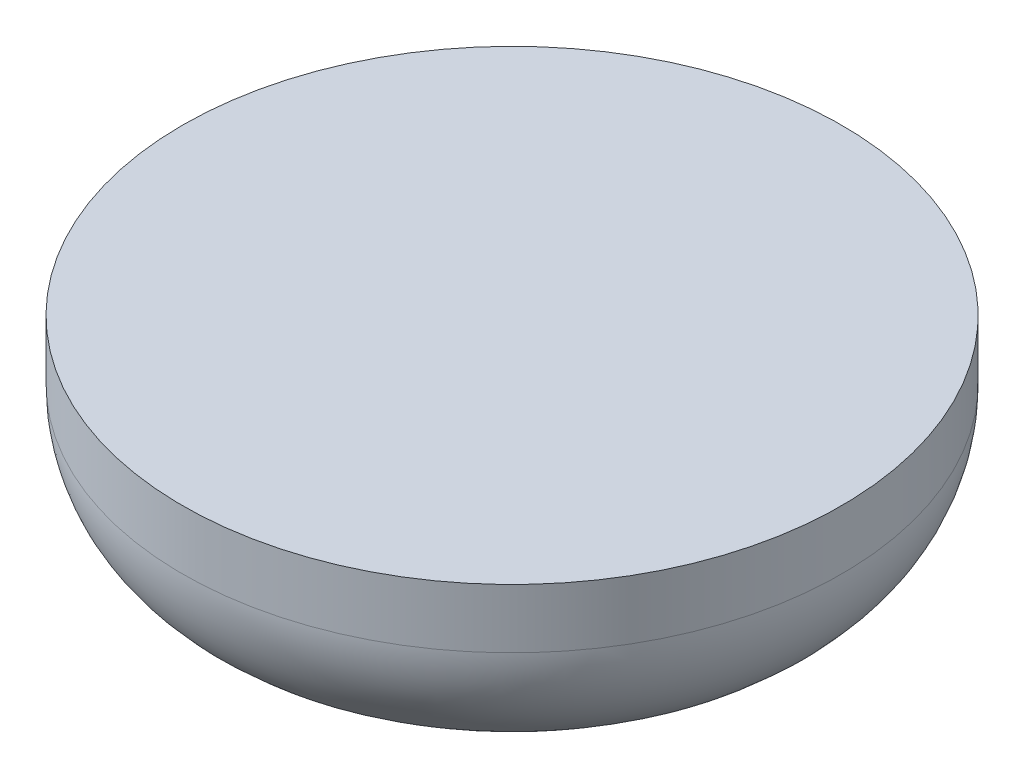
ISO-10303-21;
HEADER;
FILE_DESCRIPTION(('STEP AP214'),'2;1');
FILE_NAME('part.step','',(''),(''),'','','');
FILE_SCHEMA(('AUTOMOTIVE_DESIGN { 1 0 10303 214 1 1 1 1 }'));
ENDSEC;
DATA;
#1=APPLICATION_CONTEXT('core data for automotive mechanical design processes');
#2=APPLICATION_PROTOCOL_DEFINITION('international standard','automotive_design',2000,#1);
#3=PRODUCT_CONTEXT('',#1,'mechanical');
#4=PRODUCT('Part','Part','',(#3));
#5=PRODUCT_RELATED_PRODUCT_CATEGORY('part','',(#4));
#6=PRODUCT_DEFINITION_FORMATION('','',#4);
#7=PRODUCT_DEFINITION_CONTEXT('part definition',#1,'design');
#8=PRODUCT_DEFINITION('design','',#6,#7);
#9=PRODUCT_DEFINITION_SHAPE('','',#8);
#10=(LENGTH_UNIT() NAMED_UNIT(*) SI_UNIT(.MILLI.,.METRE.));
#11=(NAMED_UNIT(*) PLANE_ANGLE_UNIT() SI_UNIT($,.RADIAN.));
#12=(NAMED_UNIT(*) SI_UNIT($,.STERADIAN.) SOLID_ANGLE_UNIT());
#13=UNCERTAINTY_MEASURE_WITH_UNIT(LENGTH_MEASURE(1.E-05),#10,'distance_accuracy_value','');
#14=(GEOMETRIC_REPRESENTATION_CONTEXT(3) GLOBAL_UNCERTAINTY_ASSIGNED_CONTEXT((#13)) GLOBAL_UNIT_ASSIGNED_CONTEXT((#10,
#11,#12)) REPRESENTATION_CONTEXT('',''));
#15=CARTESIAN_POINT('',(0.,0.,0.));
#16=DIRECTION('',(0.,0.,1.));
#17=DIRECTION('',(1.,0.,0.));
#18=AXIS2_PLACEMENT_3D('',#15,#16,#17);
#19=CARTESIAN_POINT('',(-132.302873543367,-208.077272168841,-830.322188707988));
#20=DIRECTION('',(0.898794046299164,0.,-0.438371146789083));
#21=DIRECTION('',(-0.438371146789083,0.,-0.898794046299164));
#22=AXIS2_PLACEMENT_3D('',#19,#20,#21);
#23=PLANE('',#22);
#24=DIRECTION('',(0.,-1.,0.));
#25=VECTOR('',#24,1.);
#26=CARTESIAN_POINT('',(-132.305641032304,-208.077272165475,-830.327862901188));
#27=LINE('',#26,#25);
#28=CARTESIAN_POINT('',(-132.305641032303,-209.804472168841,-830.327862901185));
#29=VERTEX_POINT('',#28);
#30=CARTESIAN_POINT('',(-132.305641032348,-208.077272168841,-830.32786290128));
#31=VERTEX_POINT('',#30);
#32=EDGE_CURVE('E283',#29,#31,#27,.F.);
#33=ORIENTED_EDGE('',*,*,#32,.F.);
#34=DIRECTION('',(-0.438371146789083,0.,-0.898794046299164));
#35=VECTOR('',#34,1.);
#36=CARTESIAN_POINT('',(-132.302873543367,-209.804472168841,-830.322188707988));
#37=LINE('',#36,#35);
#38=CARTESIAN_POINT('',(-132.302873543382,-209.804472168841,-830.322188707977));
#39=VERTEX_POINT('',#38);
#40=EDGE_CURVE('E430',#39,#29,#37,.T.);
#41=ORIENTED_EDGE('',*,*,#40,.F.);
#42=DIRECTION('',(0.,-1.,0.));
#43=VECTOR('',#42,1.);
#44=CARTESIAN_POINT('',(-132.302873543396,-208.077272168841,-830.322188707964));
#45=LINE('',#44,#43);
#46=CARTESIAN_POINT('',(-132.302873543382,-208.077272168841,-830.322188707976));
#47=VERTEX_POINT('',#46);
#48=EDGE_CURVE('E278',#39,#47,#45,.F.);
#49=ORIENTED_EDGE('',*,*,#48,.T.);
#50=DIRECTION('',(0.438371146603138,0.,0.898794046389856));
#51=VECTOR('',#50,1.);
#52=CARTESIAN_POINT('',(-132.305641032299,-208.077272168841,-830.327862901179));
#53=LINE('',#52,#51);
#54=EDGE_CURVE('E300',#31,#47,#53,.T.);
#55=ORIENTED_EDGE('',*,*,#54,.F.);
#56=EDGE_LOOP('',(#33,#41,#49,#55));
#57=FACE_BOUND('',#56,.T.);
#58=ADVANCED_FACE('F17',(#57),#23,.F.);
#59=CARTESIAN_POINT('',(-133.340258604089,-209.804472168841,-829.723254163927));
#60=DIRECTION('',(-0.829037572555082,0.,0.559192903470687));
#61=DIRECTION('',(0.559192903470687,0.,0.829037572555082));
#62=AXIS2_PLACEMENT_3D('',#59,#60,#61);
#63=PLANE('',#62);
#64=DIRECTION('',(0.,-1.,0.));
#65=VECTOR('',#64,1.);
#66=CARTESIAN_POINT('',(-133.340258604088,-208.077272168841,-829.72325416393));
#67=LINE('',#66,#65);
#68=CARTESIAN_POINT('',(-133.340258604088,-208.077272168841,-829.72325416393));
#69=VERTEX_POINT('',#68);
#70=CARTESIAN_POINT('',(-133.340258604089,-209.804472168841,-829.723254163929));
#71=VERTEX_POINT('',#70);
#72=EDGE_CURVE('E282',#69,#71,#67,.T.);
#73=ORIENTED_EDGE('',*,*,#72,.T.);
#74=DIRECTION('',(0.559192903470687,0.,0.829037572555082));
#75=VECTOR('',#74,1.);
#76=CARTESIAN_POINT('',(-133.340258604089,-209.804472168841,-829.723254163927));
#77=LINE('',#76,#75);
#78=CARTESIAN_POINT('',(-133.343788855076,-209.804472168841,-829.728487976251));
#79=VERTEX_POINT('',#78);
#80=EDGE_CURVE('E429',#79,#71,#77,.T.);
#81=ORIENTED_EDGE('',*,*,#80,.F.);
#82=DIRECTION('',(0.,-1.,0.));
#83=VECTOR('',#82,1.);
#84=CARTESIAN_POINT('',(-133.343788855079,-208.077272168841,-829.728487976257));
#85=LINE('',#84,#83);
#86=CARTESIAN_POINT('',(-133.343788855171,-208.077272168841,-829.728487976392));
#87=VERTEX_POINT('',#86);
#88=EDGE_CURVE('E277',#87,#79,#85,.T.);
#89=ORIENTED_EDGE('',*,*,#88,.F.);
#90=DIRECTION('',(-0.559192903748581,0.,-0.82903757236764));
#91=VECTOR('',#90,1.);
#92=CARTESIAN_POINT('',(-133.340258604088,-208.077272168841,-829.72325416393));
#93=LINE('',#92,#91);
#94=EDGE_CURVE('E416',#69,#87,#93,.T.);
#95=ORIENTED_EDGE('',*,*,#94,.F.);
#96=EDGE_LOOP('',(#73,#81,#89,#95));
#97=FACE_BOUND('',#96,.T.);
#98=ADVANCED_FACE('F564',(#97),#63,.F.);
#99=CARTESIAN_POINT('',(-135.028393202501,-209.804472168841,-829.728487976248));
#100=DIRECTION('',(0.829037572555081,0.,0.559192903470688));
#101=DIRECTION('',(0.559192903470688,0.,-0.829037572555081));
#102=AXIS2_PLACEMENT_3D('',#99,#100,#101);
#103=PLANE('',#102);
#104=DIRECTION('',(0.,-1.,0.));
#105=VECTOR('',#104,1.);
#106=CARTESIAN_POINT('',(-135.028393202503,-208.077272168841,-829.728487976248));
#107=LINE('',#106,#105);
#108=CARTESIAN_POINT('',(-135.028393202503,-209.804472168841,-829.728487976247));
#109=VERTEX_POINT('',#108);
#110=CARTESIAN_POINT('',(-135.028393202572,-208.077272168841,-829.728487976146));
#111=VERTEX_POINT('',#110);
#112=EDGE_CURVE('E273',#109,#111,#107,.F.);
#113=ORIENTED_EDGE('',*,*,#112,.F.);
#114=DIRECTION('',(0.559192903470688,0.,-0.829037572555081));
#115=VECTOR('',#114,1.);
#116=CARTESIAN_POINT('',(-135.028393202501,-209.804472168841,-829.728487976248));
#117=LINE('',#116,#115);
#118=CARTESIAN_POINT('',(-135.031923453496,-209.804472168841,-829.723254163932));
#119=VERTEX_POINT('',#118);
#120=EDGE_CURVE('E427',#119,#109,#117,.T.);
#121=ORIENTED_EDGE('',*,*,#120,.F.);
#122=DIRECTION('',(0.,-1.,0.));
#123=VECTOR('',#122,1.);
#124=CARTESIAN_POINT('',(-135.031923453506,-208.077272168841,-829.723254163935));
#125=LINE('',#124,#123);
#126=CARTESIAN_POINT('',(-135.031923453496,-208.077272168841,-829.723254163932));
#127=VERTEX_POINT('',#126);
#128=EDGE_CURVE('E268',#119,#127,#125,.F.);
#129=ORIENTED_EDGE('',*,*,#128,.T.);
#130=DIRECTION('',(-0.559192903271263,0.,0.829037572689595));
#131=VECTOR('',#130,1.);
#132=CARTESIAN_POINT('',(-135.028393202519,-208.077272168841,-829.728487976225));
#133=LINE('',#132,#131);
#134=EDGE_CURVE('E413',#111,#127,#133,.T.);
#135=ORIENTED_EDGE('',*,*,#134,.F.);
#136=EDGE_LOOP('',(#113,#121,#129,#135));
#137=FACE_BOUND('',#136,.T.);
#138=ADVANCED_FACE('F561',(#137),#103,.F.);
#139=CARTESIAN_POINT('',(-136.06930851421,-208.077272168841,-830.322188707988));
#140=DIRECTION('',(-0.898794046299164,0.,-0.438371146789084));
#141=DIRECTION('',(-0.438371146789084,0.,0.898794046299164));
#142=AXIS2_PLACEMENT_3D('',#139,#140,#141);
#143=PLANE('',#142);
#144=DIRECTION('',(0.,-1.,0.));
#145=VECTOR('',#144,1.);
#146=CARTESIAN_POINT('',(-136.069308514209,-208.077272168841,-830.32218870799));
#147=LINE('',#146,#145);
#148=CARTESIAN_POINT('',(-136.069308514209,-208.077272168841,-830.32218870799));
#149=VERTEX_POINT('',#148);
#150=CARTESIAN_POINT('',(-136.069308514209,-209.804472168841,-830.32218870799));
#151=VERTEX_POINT('',#150);
#152=EDGE_CURVE('E272',#149,#151,#147,.T.);
#153=ORIENTED_EDGE('',*,*,#152,.T.);
#154=DIRECTION('',(-0.438371146789084,0.,0.898794046299164));
#155=VECTOR('',#154,1.);
#156=CARTESIAN_POINT('',(-136.06930851421,-209.804472168841,-830.322188707988));
#157=LINE('',#156,#155);
#158=CARTESIAN_POINT('',(-136.066541025279,-209.804472168841,-830.327862901175));
#159=VERTEX_POINT('',#158);
#160=EDGE_CURVE('E425',#159,#151,#157,.T.);
#161=ORIENTED_EDGE('',*,*,#160,.F.);
#162=DIRECTION('',(0.,-1.,0.));
#163=VECTOR('',#162,1.);
#164=CARTESIAN_POINT('',(-136.066541025283,-208.077272166654,-830.327862901168));
#165=LINE('',#164,#163);
#166=CARTESIAN_POINT('',(-136.066541025289,-208.077272168841,-830.327862901155));
#167=VERTEX_POINT('',#166);
#168=EDGE_CURVE('E264',#167,#159,#165,.T.);
#169=ORIENTED_EDGE('',*,*,#168,.F.);
#170=DIRECTION('',(0.438371146827899,0.,-0.898794046280232));
#171=VECTOR('',#170,1.);
#172=CARTESIAN_POINT('',(-136.069308514209,-208.077272168841,-830.32218870799));
#173=LINE('',#172,#171);
#174=EDGE_CURVE('E298',#149,#167,#173,.T.);
#175=ORIENTED_EDGE('',*,*,#174,.F.);
#176=EDGE_LOOP('',(#153,#161,#169,#175));
#177=FACE_BOUND('',#176,.T.);
#178=ADVANCED_FACE('F557',(#177),#143,.F.);
#179=CARTESIAN_POINT('',(-136.909252698702,-209.804472168841,-831.786801696392));
#180=DIRECTION('',(-0.0697564737442021,0.,0.997564050259819));
#181=DIRECTION('',(0.997564050259819,0.,0.0697564737442021));
#182=AXIS2_PLACEMENT_3D('',#179,#180,#181);
#183=PLANE('',#182);
#184=DIRECTION('',(-0.997564050259819,0.,-0.0697564737442021));
#185=VECTOR('',#184,1.);
#186=CARTESIAN_POINT('',(-131.579770728705,-208.077272168841,-831.414128012919));
#187=LINE('',#186,#185);
#188=CARTESIAN_POINT('',(-136.909828497961,-208.077272168841,-831.786841719572));
#189=VERTEX_POINT('',#188);
#190=CARTESIAN_POINT('',(-136.91514093891,-208.077272168841,-831.787213442258));
#191=VERTEX_POINT('',#190);
#192=EDGE_CURVE('E295',#189,#191,#187,.T.);
#193=ORIENTED_EDGE('',*,*,#192,.F.);
#194=CARTESIAN_POINT('',(-136.910071592134,-209.804472168841,-831.786858211017));
#195=CARTESIAN_POINT('',(-136.910061463819,-209.732505502174,-831.78685751511));
#196=CARTESIAN_POINT('',(-136.910051335514,-209.660538835508,-831.786856819051));
#197=CARTESIAN_POINT('',(-136.910031078924,-209.516605502174,-831.78685542663));
#198=CARTESIAN_POINT('',(-136.91002095064,-209.444638835508,-831.786854730268));
#199=CARTESIAN_POINT('',(-136.910000694092,-209.300705502174,-831.78685333724));
#200=CARTESIAN_POINT('',(-136.909990565829,-209.228738835508,-831.786852640574));
#201=CARTESIAN_POINT('',(-136.909970309323,-209.084805502174,-831.786851246939));
#202=CARTESIAN_POINT('',(-136.909960181081,-209.012838835508,-831.786850549969));
#203=CARTESIAN_POINT('',(-136.909939924617,-208.868905502174,-831.786849155727));
#204=CARTESIAN_POINT('',(-136.909929796395,-208.796938835508,-831.786848458454));
#205=CARTESIAN_POINT('',(-136.909909539973,-208.653005502174,-831.786847063604));
#206=CARTESIAN_POINT('',(-136.909899411772,-208.581038835508,-831.786846366027));
#207=CARTESIAN_POINT('',(-136.909879155392,-208.437105502174,-831.78684497057));
#208=CARTESIAN_POINT('',(-136.909869027212,-208.365138835508,-831.78684427269));
#209=CARTESIAN_POINT('',(-136.909848770873,-208.221205502174,-831.786842876626));
#210=CARTESIAN_POINT('',(-136.909838642715,-208.149238835508,-831.786842178442));
#211=CARTESIAN_POINT('',(-136.909828514566,-208.077272168841,-831.786841480106));
#212=B_SPLINE_CURVE_WITH_KNOTS('',3,(#194,#195,#196,#197,#198,#199,#200,#201,#202,#203,#204,
#205,#206,#207,#208,#209,#210,#211),.UNSPECIFIED.,.F.,.F.,(4,2,2,2,2,2,2,2,4),(0.,
0.215900002148216,0.43180000429646,0.647700006444676,0.863600008592892,1.07950001074111,
1.29540001288932,1.51130001503757,1.72720001718578),.UNSPECIFIED.);
#213=CARTESIAN_POINT('',(-136.910071566561,-209.804472168841,-831.78685858322));
#214=VERTEX_POINT('',#213);
#215=EDGE_CURVE('E260',#214,#189,#212,.T.);
#216=ORIENTED_EDGE('',*,*,#215,.F.);
#217=DIRECTION('',(0.997564050259819,0.,0.0697564737442021));
#218=VECTOR('',#217,1.);
#219=CARTESIAN_POINT('',(-136.909252698702,-209.804472168841,-831.786801696392));
#220=LINE('',#219,#218);
#221=CARTESIAN_POINT('',(-136.91514093891,-209.804472168841,-831.787213442258));
#222=VERTEX_POINT('',#221);
#223=EDGE_CURVE('E195',#222,#214,#220,.T.);
#224=ORIENTED_EDGE('',*,*,#223,.F.);
#225=DIRECTION('',(0.,-1.,0.));
#226=VECTOR('',#225,1.);
#227=CARTESIAN_POINT('',(-136.915140938912,-209.804472168841,-831.787213442258));
#228=LINE('',#227,#226);
#229=EDGE_CURVE('E209',#222,#191,#228,.F.);
#230=ORIENTED_EDGE('',*,*,#229,.T.);
#231=EDGE_LOOP('',(#193,#216,#224,#230));
#232=FACE_BOUND('',#231,.T.);
#233=ADVANCED_FACE('F551',(#232),#183,.F.);
#234=CARTESIAN_POINT('',(-136.91514093893,-208.077272168841,-832.985082530379));
#235=DIRECTION('',(-0.0697564737440415,0.,-0.99756405025983));
#236=DIRECTION('',(-0.99756405025983,0.,0.0697564737440415));
#237=AXIS2_PLACEMENT_3D('',#234,#235,#236);
#238=PLANE('',#237);
#239=DIRECTION('',(0.997557731800345,0.,-0.0698467731921129));
#240=VECTOR('',#239,1.);
#241=CARTESIAN_POINT('',(-136.915118919542,-208.077272168841,-832.985084070124));
#242=LINE('',#241,#240);
#243=CARTESIAN_POINT('',(-136.915140938909,-208.077272168841,-832.985082530381));
#244=VERTEX_POINT('',#243);
#245=CARTESIAN_POINT('',(-136.909828495376,-208.077272168841,-832.985454493855));
#246=VERTEX_POINT('',#245);
#247=EDGE_CURVE('E200',#244,#246,#242,.T.);
#248=ORIENTED_EDGE('',*,*,#247,.F.);
#249=DIRECTION('',(0.,-1.,0.));
#250=VECTOR('',#249,1.);
#251=CARTESIAN_POINT('',(-136.915140938909,-208.077272168841,-832.985082530381));
#252=LINE('',#251,#250);
#253=CARTESIAN_POINT('',(-136.915140938909,-209.804472168841,-832.985082530381));
#254=VERTEX_POINT('',#253);
#255=EDGE_CURVE('E198',#244,#254,#252,.T.);
#256=ORIENTED_EDGE('',*,*,#255,.T.);
#257=DIRECTION('',(-0.997564050260059,0.,0.069756473740763));
#258=VECTOR('',#257,1.);
#259=CARTESIAN_POINT('',(-136.909828461889,-209.804472168841,-832.985454014962));
#260=LINE('',#259,#258);
#261=CARTESIAN_POINT('',(-136.909828478632,-209.804472168841,-832.985454254408));
#262=VERTEX_POINT('',#261);
#263=EDGE_CURVE('E184',#262,#254,#260,.T.);
#264=ORIENTED_EDGE('',*,*,#263,.F.);
#265=DIRECTION('',(0.,-1.,0.));
#266=VECTOR('',#265,1.);
#267=CARTESIAN_POINT('',(-136.909828495376,-208.077272168841,-832.985454493854));
#268=LINE('',#267,#266);
#269=EDGE_CURVE('E256',#246,#262,#268,.T.);
#270=ORIENTED_EDGE('',*,*,#269,.F.);
#271=EDGE_LOOP('',(#248,#256,#264,#270));
#272=FACE_BOUND('',#271,.T.);
#273=ADVANCED_FACE('F199',(#272),#238,.F.);
#274=CARTESIAN_POINT('',(-136.066541025273,-209.804472168841,-834.444433071449));
#275=DIRECTION('',(-0.898794046299164,0.,0.438371146789083));
#276=DIRECTION('',(0.438371146789083,0.,0.898794046299164));
#277=AXIS2_PLACEMENT_3D('',#274,#275,#276);
#278=PLANE('',#277);
#279=DIRECTION('',(0.,-1.,0.));
#280=VECTOR('',#279,1.);
#281=CARTESIAN_POINT('',(-136.066541025272,-208.077272168841,-834.444433071446));
#282=LINE('',#281,#280);
#283=CARTESIAN_POINT('',(-136.066541025274,-209.804472168841,-834.44443307145));
#284=VERTEX_POINT('',#283);
#285=CARTESIAN_POINT('',(-136.066541025248,-208.077272168841,-834.444433071397));
#286=VERTEX_POINT('',#285);
#287=EDGE_CURVE('E342',#284,#286,#282,.F.);
#288=ORIENTED_EDGE('',*,*,#287,.F.);
#289=DIRECTION('',(0.438371146789083,0.,0.898794046299164));
#290=VECTOR('',#289,1.);
#291=CARTESIAN_POINT('',(-136.066541025273,-209.804472168841,-834.444433071449));
#292=LINE('',#291,#290);
#293=CARTESIAN_POINT('',(-136.069308514207,-209.804472168841,-834.450107264652));
#294=VERTEX_POINT('',#293);
#295=EDGE_CURVE('E194',#294,#284,#292,.T.);
#296=ORIENTED_EDGE('',*,*,#295,.F.);
#297=DIRECTION('',(0.,-1.,0.));
#298=VECTOR('',#297,1.);
#299=CARTESIAN_POINT('',(-136.069308514203,-208.077272168841,-834.450107264656));
#300=LINE('',#299,#298);
#301=CARTESIAN_POINT('',(-136.069308514206,-208.077272168841,-834.450107264652));
#302=VERTEX_POINT('',#301);
#303=EDGE_CURVE('E254',#294,#302,#300,.F.);
#304=ORIENTED_EDGE('',*,*,#303,.T.);
#305=DIRECTION('',(-0.438371146683666,0.,-0.89879404635058));
#306=VECTOR('',#305,1.);
#307=CARTESIAN_POINT('',(-136.06654102527,-208.077272168841,-834.444433071442));
#308=LINE('',#307,#306);
#309=EDGE_CURVE('E294',#286,#302,#308,.T.);
#310=ORIENTED_EDGE('',*,*,#309,.F.);
#311=EDGE_LOOP('',(#288,#296,#304,#310));
#312=FACE_BOUND('',#311,.T.);
#313=ADVANCED_FACE('F543',(#312),#278,.F.);
#314=CARTESIAN_POINT('',(-135.028393202492,-208.077272168841,-835.043807996374));
#315=DIRECTION('',(0.829037572555082,0.,-0.559192903470687));
#316=DIRECTION('',(-0.559192903470687,0.,-0.829037572555082));
#317=AXIS2_PLACEMENT_3D('',#314,#315,#316);
#318=PLANE('',#317);
#319=DIRECTION('',(0.,-1.,0.));
#320=VECTOR('',#319,1.);
#321=CARTESIAN_POINT('',(-135.03192345349,-208.077272168841,-835.04904180871));
#322=LINE('',#321,#320);
#323=CARTESIAN_POINT('',(-135.03192345349,-208.077272168841,-835.04904180871));
#324=VERTEX_POINT('',#323);
#325=CARTESIAN_POINT('',(-135.031923453489,-209.804472168841,-835.04904180871));
#326=VERTEX_POINT('',#325);
#327=EDGE_CURVE('E331',#324,#326,#322,.T.);
#328=ORIENTED_EDGE('',*,*,#327,.T.);
#329=DIRECTION('',(-0.559192903470687,0.,-0.829037572555082));
#330=VECTOR('',#329,1.);
#331=CARTESIAN_POINT('',(-135.028393202492,-209.804472168841,-835.043807996374));
#332=LINE('',#331,#330);
#333=CARTESIAN_POINT('',(-135.0283932025,-209.804472168841,-835.043807996386));
#334=VERTEX_POINT('',#333);
#335=EDGE_CURVE('E334',#334,#326,#332,.T.);
#336=ORIENTED_EDGE('',*,*,#335,.F.);
#337=DIRECTION('',(0.,-1.,0.));
#338=VECTOR('',#337,1.);
#339=CARTESIAN_POINT('',(-135.028393202494,-208.077272168841,-835.04380799638));
#340=LINE('',#339,#338);
#341=CARTESIAN_POINT('',(-135.028393202417,-208.077272168841,-835.043807996264));
#342=VERTEX_POINT('',#341);
#343=EDGE_CURVE('E253',#342,#334,#340,.T.);
#344=ORIENTED_EDGE('',*,*,#343,.F.);
#345=DIRECTION('',(0.559192903711077,0.,0.829037572392937));
#346=VECTOR('',#345,1.);
#347=CARTESIAN_POINT('',(-135.03192345349,-208.077272168841,-835.04904180871));
#348=LINE('',#347,#346);
#349=EDGE_CURVE('E341',#324,#342,#348,.T.);
#350=ORIENTED_EDGE('',*,*,#349,.F.);
#351=EDGE_LOOP('',(#328,#336,#344,#350));
#352=FACE_BOUND('',#351,.T.);
#353=ADVANCED_FACE('F339',(#352),#318,.F.);
#354=CARTESIAN_POINT('',(-133.343788855076,-208.077272168841,-835.04380799639));
#355=DIRECTION('',(-0.829037572555004,0.,-0.559192903470803));
#356=DIRECTION('',(-0.559192903470803,0.,0.829037572555004));
#357=AXIS2_PLACEMENT_3D('',#354,#355,#356);
#358=PLANE('',#357);
#359=DIRECTION('',(0.,-1.,0.));
#360=VECTOR('',#359,1.);
#361=CARTESIAN_POINT('',(-133.343788855082,-208.077272168841,-835.04380799638));
#362=LINE('',#361,#360);
#363=CARTESIAN_POINT('',(-133.343788855077,-209.804472168841,-835.043807996387));
#364=VERTEX_POINT('',#363);
#365=CARTESIAN_POINT('',(-133.3437888551,-208.077272168841,-835.043807996352));
#366=VERTEX_POINT('',#365);
#367=EDGE_CURVE('E249',#364,#366,#362,.F.);
#368=ORIENTED_EDGE('',*,*,#367,.F.);
#369=DIRECTION('',(-0.559192903470803,0.,0.829037572555004));
#370=VECTOR('',#369,1.);
#371=CARTESIAN_POINT('',(-133.343788855076,-209.804472168841,-835.04380799639));
#372=LINE('',#371,#370);
#373=CARTESIAN_POINT('',(-133.340258604086,-209.804472168841,-835.04904180871));
#374=VERTEX_POINT('',#373);
#375=EDGE_CURVE('E337',#374,#364,#372,.T.);
#376=ORIENTED_EDGE('',*,*,#375,.F.);
#377=DIRECTION('',(0.,-1.,0.));
#378=VECTOR('',#377,1.);
#379=CARTESIAN_POINT('',(-133.340258604083,-208.077272168841,-835.049041808709));
#380=LINE('',#379,#378);
#381=CARTESIAN_POINT('',(-133.340258604086,-208.077272168841,-835.04904180871));
#382=VERTEX_POINT('',#381);
#383=EDGE_CURVE('E244',#374,#382,#380,.F.);
#384=ORIENTED_EDGE('',*,*,#383,.T.);
#385=DIRECTION('',(0.559192903538694,0.,-0.829037572509211));
#386=VECTOR('',#385,1.);
#387=CARTESIAN_POINT('',(-133.343788855066,-208.077272168841,-835.043807996404));
#388=LINE('',#387,#386);
#389=EDGE_CURVE('E406',#366,#382,#388,.T.);
#390=ORIENTED_EDGE('',*,*,#389,.F.);
#391=EDGE_LOOP('',(#368,#376,#384,#390));
#392=FACE_BOUND('',#391,.T.);
#393=ADVANCED_FACE('F539',(#392),#358,.F.);
#394=CARTESIAN_POINT('',(-132.302873543367,-209.804472168841,-834.450107264649));
#395=DIRECTION('',(0.898794046299164,0.,0.438371146789084));
#396=DIRECTION('',(0.438371146789084,0.,-0.898794046299164));
#397=AXIS2_PLACEMENT_3D('',#394,#395,#396);
#398=PLANE('',#397);
#399=DIRECTION('',(0.,-1.,0.));
#400=VECTOR('',#399,1.);
#401=CARTESIAN_POINT('',(-132.302873543369,-208.077272168841,-834.450107264652));
#402=LINE('',#401,#400);
#403=CARTESIAN_POINT('',(-132.302873543369,-208.077272168841,-834.450107264652));
#404=VERTEX_POINT('',#403);
#405=CARTESIAN_POINT('',(-132.302873543368,-209.804472168841,-834.450107264651));
#406=VERTEX_POINT('',#405);
#407=EDGE_CURVE('E248',#404,#406,#402,.T.);
#408=ORIENTED_EDGE('',*,*,#407,.T.);
#409=DIRECTION('',(0.438371146789084,0.,-0.898794046299164));
#410=VECTOR('',#409,1.);
#411=CARTESIAN_POINT('',(-132.302873543367,-209.804472168841,-834.450107264649));
#412=LINE('',#411,#410);
#413=CARTESIAN_POINT('',(-132.305641032301,-209.804472168841,-834.444433071457));
#414=VERTEX_POINT('',#413);
#415=EDGE_CURVE('E301',#414,#406,#412,.T.);
#416=ORIENTED_EDGE('',*,*,#415,.F.);
#417=DIRECTION('',(0.,-1.,0.));
#418=VECTOR('',#417,1.);
#419=CARTESIAN_POINT('',(-132.305641032302,-208.077272165475,-834.444433071456));
#420=LINE('',#419,#418);
#421=CARTESIAN_POINT('',(-132.305641032412,-208.077272168841,-834.444433071229));
#422=VERTEX_POINT('',#421);
#423=EDGE_CURVE('E243',#422,#414,#420,.T.);
#424=ORIENTED_EDGE('',*,*,#423,.F.);
#425=DIRECTION('',(-0.438371146341147,0.,0.898794046517637));
#426=VECTOR('',#425,1.);
#427=CARTESIAN_POINT('',(-132.302873543369,-208.077272168841,-834.450107264652));
#428=LINE('',#427,#426);
#429=EDGE_CURVE('E292',#404,#422,#428,.T.);
#430=ORIENTED_EDGE('',*,*,#429,.F.);
#431=EDGE_LOOP('',(#408,#416,#424,#430));
#432=FACE_BOUND('',#431,.T.);
#433=ADVANCED_FACE('F533',(#432),#398,.F.);
#434=CARTESIAN_POINT('',(-131.325592617661,-208.077272168841,-835.049044348711));
#435=DIRECTION('',(0.,-1.,0.));
#436=DIRECTION('',(1.,0.,0.));
#437=AXIS2_PLACEMENT_3D('',#434,#435,#436);
#438=PLANE('',#437);
#439=ORIENTED_EDGE('',*,*,#429,.T.);
#440=CARTESIAN_POINT('',(-131.392466281261,-208.077272168841,-833.99904798632));
#441=DIRECTION('',(0.,-1.,0.));
#442=DIRECTION('',(1.,0.,0.));
#443=AXIS2_PLACEMENT_3D('',#440,#441,#442);
#444=CIRCLE('',#443,1.01599999999998);
#445=CARTESIAN_POINT('',(-131.462353581171,-208.077272168841,-832.985454254563));
#446=VERTEX_POINT('',#445);
#447=EDGE_CURVE('E236',#446,#422,#444,.T.);
#448=ORIENTED_EDGE('',*,*,#447,.F.);
#449=DIRECTION('',(-0.997564050259824,0.,-0.0697564737441323));
#450=VECTOR('',#449,1.);
#451=CARTESIAN_POINT('',(-131.457041118668,-208.077272168841,-832.985082530379));
#452=LINE('',#451,#450);
#453=CARTESIAN_POINT('',(-131.457041118667,-208.077272168841,-832.985082530379));
#454=VERTEX_POINT('',#453);
#455=EDGE_CURVE('E287',#446,#454,#452,.F.);
#456=ORIENTED_EDGE('',*,*,#455,.T.);
#457=CARTESIAN_POINT('',(-134.186091028788,-208.077272168841,-832.38614798632));
#458=DIRECTION('',(0.,-1.,0.));
#459=DIRECTION('',(0.,0.,-1.));
#460=AXIS2_PLACEMENT_3D('',#457,#458,#459);
#461=CIRCLE('',#460,2.79399999999997);
#462=CARTESIAN_POINT('',(-131.457041118667,-208.077272168841,-831.787213442259));
#463=VERTEX_POINT('',#462);
#464=EDGE_CURVE('E299',#454,#463,#461,.T.);
#465=ORIENTED_EDGE('',*,*,#464,.T.);
#466=DIRECTION('',(-0.997564050259456,0.,0.0697564737493903));
#467=VECTOR('',#466,1.);
#468=CARTESIAN_POINT('',(-131.457066243842,-208.077272168841,-831.787211685336));
#469=LINE('',#468,#467);
#470=CARTESIAN_POINT('',(-131.462355086573,-208.077272168841,-831.786841613542));
#471=VERTEX_POINT('',#470);
#472=EDGE_CURVE('E288',#463,#471,#469,.T.);
#473=ORIENTED_EDGE('',*,*,#472,.T.);
#474=CARTESIAN_POINT('',(-131.392466281261,-208.077272168841,-830.77324798632));
#475=DIRECTION('',(0.,-1.,0.));
#476=DIRECTION('',(0.,0.,-1.));
#477=AXIS2_PLACEMENT_3D('',#474,#475,#476);
#478=CIRCLE('',#477,1.01599999999999);
#479=EDGE_CURVE('E279',#31,#471,#478,.T.);
#480=ORIENTED_EDGE('',*,*,#479,.F.);
#481=ORIENTED_EDGE('',*,*,#54,.T.);
#482=CARTESIAN_POINT('',(-134.186091028788,-208.077272168841,-832.38614798632));
#483=DIRECTION('',(0.,-1.,0.));
#484=DIRECTION('',(0.,0.,-1.));
#485=AXIS2_PLACEMENT_3D('',#482,#483,#484);
#486=CIRCLE('',#485,2.79399999999997);
#487=EDGE_CURVE('E274',#47,#69,#486,.T.);
#488=ORIENTED_EDGE('',*,*,#487,.T.);
#489=ORIENTED_EDGE('',*,*,#94,.T.);
#490=CARTESIAN_POINT('',(-134.186091028788,-208.077272168841,-829.16034798632));
#491=DIRECTION('',(0.,-1.,0.));
#492=DIRECTION('',(0.,0.,-1.));
#493=AXIS2_PLACEMENT_3D('',#490,#491,#492);
#494=CIRCLE('',#493,1.01600000000001);
#495=EDGE_CURVE('E269',#111,#87,#494,.T.);
#496=ORIENTED_EDGE('',*,*,#495,.F.);
#497=ORIENTED_EDGE('',*,*,#134,.T.);
#498=CARTESIAN_POINT('',(-134.186091028788,-208.077272168841,-832.38614798632));
#499=DIRECTION('',(0.,-1.,0.));
#500=DIRECTION('',(1.,0.,0.));
#501=AXIS2_PLACEMENT_3D('',#498,#499,#500);
#502=CIRCLE('',#501,2.79399999999997);
#503=EDGE_CURVE('E265',#127,#149,#502,.T.);
#504=ORIENTED_EDGE('',*,*,#503,.T.);
#505=ORIENTED_EDGE('',*,*,#174,.T.);
#506=CARTESIAN_POINT('',(-136.979715776316,-208.077272168841,-830.77324798632));
#507=DIRECTION('',(0.,-1.,0.));
#508=DIRECTION('',(1.,0.,0.));
#509=AXIS2_PLACEMENT_3D('',#506,#507,#508);
#510=CIRCLE('',#509,1.016);
#511=EDGE_CURVE('E261',#189,#167,#510,.T.);
#512=ORIENTED_EDGE('',*,*,#511,.F.);
#513=ORIENTED_EDGE('',*,*,#192,.T.);
#514=CARTESIAN_POINT('',(-134.186091028788,-208.077272168841,-832.38614798632));
#515=DIRECTION('',(0.,-1.,0.));
#516=DIRECTION('',(1.,0.,0.));
#517=AXIS2_PLACEMENT_3D('',#514,#515,#516);
#518=CIRCLE('',#517,2.79399999999997);
#519=EDGE_CURVE('E205',#191,#244,#518,.T.);
#520=ORIENTED_EDGE('',*,*,#519,.T.);
#521=ORIENTED_EDGE('',*,*,#247,.T.);
#522=CARTESIAN_POINT('',(-136.979715776316,-208.077272168841,-833.999047986317));
#523=DIRECTION('',(0.,-1.,0.));
#524=DIRECTION('',(0.,0.,-1.));
#525=AXIS2_PLACEMENT_3D('',#522,#523,#524);
#526=CIRCLE('',#525,1.01599999999995);
#527=EDGE_CURVE('E204',#286,#246,#526,.T.);
#528=ORIENTED_EDGE('',*,*,#527,.F.);
#529=ORIENTED_EDGE('',*,*,#309,.T.);
#530=CARTESIAN_POINT('',(-134.186091028788,-208.077272168841,-832.38614798632));
#531=DIRECTION('',(0.,-1.,0.));
#532=DIRECTION('',(1.,0.,0.));
#533=AXIS2_PLACEMENT_3D('',#530,#531,#532);
#534=CIRCLE('',#533,2.79399999999997);
#535=EDGE_CURVE('E250',#302,#324,#534,.T.);
#536=ORIENTED_EDGE('',*,*,#535,.T.);
#537=ORIENTED_EDGE('',*,*,#349,.T.);
#538=CARTESIAN_POINT('',(-134.186091028788,-208.077272168841,-835.61194798632));
#539=DIRECTION('',(0.,-1.,0.));
#540=DIRECTION('',(0.,0.,-1.));
#541=AXIS2_PLACEMENT_3D('',#538,#539,#540);
#542=CIRCLE('',#541,1.01599999999999);
#543=EDGE_CURVE('E245',#366,#342,#542,.T.);
#544=ORIENTED_EDGE('',*,*,#543,.F.);
#545=ORIENTED_EDGE('',*,*,#389,.T.);
#546=CARTESIAN_POINT('',(-134.186091028788,-208.077272168841,-832.38614798632));
#547=DIRECTION('',(0.,-1.,0.));
#548=DIRECTION('',(0.,0.,-1.));
#549=AXIS2_PLACEMENT_3D('',#546,#547,#548);
#550=CIRCLE('',#549,2.79399999999997);
#551=EDGE_CURVE('E240',#382,#404,#550,.T.);
#552=ORIENTED_EDGE('',*,*,#551,.T.);
#553=EDGE_LOOP('',(#439,#448,#456,#465,#473,#480,#481,#488,#489,#496,#497,#504,#505,#512,#513,
#520,#521,#528,#529,#536,#537,#544,#545,#552));
#554=FACE_BOUND('',#553,.T.);
#555=ADVANCED_FACE('F529',(#554),#438,.T.);
#556=CARTESIAN_POINT('',(-131.457041118668,-209.804472168841,-831.787213442259));
#557=DIRECTION('',(0.0697564737441112,0.,0.997564050259825));
#558=DIRECTION('',(0.997564050259825,0.,-0.0697564737441112));
#559=AXIS2_PLACEMENT_3D('',#556,#557,#558);
#560=PLANE('',#559);
#561=ORIENTED_EDGE('',*,*,#472,.F.);
#562=DIRECTION('',(0.,-1.,0.));
#563=VECTOR('',#562,1.);
#564=CARTESIAN_POINT('',(-131.457041118667,-208.077272168841,-831.787213442259));
#565=LINE('',#564,#563);
#566=CARTESIAN_POINT('',(-131.457041118667,-209.804472168841,-831.787213442259));
#567=VERTEX_POINT('',#566);
#568=EDGE_CURVE('E233',#463,#567,#565,.T.);
#569=ORIENTED_EDGE('',*,*,#568,.T.);
#570=DIRECTION('',(0.997564050260054,0.,-0.0697564737408312));
#571=VECTOR('',#570,1.);
#572=CARTESIAN_POINT('',(-131.462110485409,-209.804472168841,-831.786858957604));
#573=LINE('',#572,#571);
#574=CARTESIAN_POINT('',(-131.462110459834,-209.804472168841,-831.786858585382));
#575=VERTEX_POINT('',#574);
#576=EDGE_CURVE('E290',#575,#567,#573,.T.);
#577=ORIENTED_EDGE('',*,*,#576,.F.);
#578=CARTESIAN_POINT('',(-131.462355070112,-208.077272168841,-831.786841374811));
#579=CARTESIAN_POINT('',(-131.462344877036,-208.149238835508,-831.786842077639));
#580=CARTESIAN_POINT('',(-131.46233468395,-208.221205502174,-831.786842780313));
#581=CARTESIAN_POINT('',(-131.462314297756,-208.365138835508,-831.786844185354));
#582=CARTESIAN_POINT('',(-131.462304104648,-208.437105502174,-831.786844887721));
#583=CARTESIAN_POINT('',(-131.462283718412,-208.581038835508,-831.786846292146));
#584=CARTESIAN_POINT('',(-131.462273525283,-208.653005502174,-831.786846994205));
#585=CARTESIAN_POINT('',(-131.462253139004,-208.796938835508,-831.786848398016));
#586=CARTESIAN_POINT('',(-131.462242945854,-208.868905502174,-831.786849099768));
#587=CARTESIAN_POINT('',(-131.462222559533,-209.012838835508,-831.786850502963));
#588=CARTESIAN_POINT('',(-131.462212366362,-209.084805502174,-831.786851204408));
#589=CARTESIAN_POINT('',(-131.462191979998,-209.228738835508,-831.786852606988));
#590=CARTESIAN_POINT('',(-131.462181786806,-209.300705502174,-831.786853308125));
#591=CARTESIAN_POINT('',(-131.4621614004,-209.444638835508,-831.78685471009));
#592=CARTESIAN_POINT('',(-131.462151207187,-209.516605502174,-831.786855410919));
#593=CARTESIAN_POINT('',(-131.462130820739,-209.660538835508,-831.78685681227));
#594=CARTESIAN_POINT('',(-131.462120627504,-209.732505502174,-831.786857512792));
#595=CARTESIAN_POINT('',(-131.462110434259,-209.804472168841,-831.786858213159));
#596=B_SPLINE_CURVE_WITH_KNOTS('',3,(#578,#579,#580,#581,#582,#583,#584,#585,#586,#587,#588,
#589,#590,#591,#592,#593,#594,#595),.UNSPECIFIED.,.F.,.F.,(4,2,2,2,2,2,2,2,4),(0.,
0.215900002175848,0.431800004351723,0.647700006527571,0.863600008703418,1.07950001087927,
1.29540001305511,1.51130001523099,1.72720001740684),.UNSPECIFIED.);
#597=EDGE_CURVE('E286',#471,#575,#596,.T.);
#598=ORIENTED_EDGE('',*,*,#597,.F.);
#599=EDGE_LOOP('',(#561,#569,#577,#598));
#600=FACE_BOUND('',#599,.T.);
#601=ADVANCED_FACE('F440',(#600),#560,.F.);
#602=CARTESIAN_POINT('',(-131.457041118668,-208.077272168841,-832.985082530379));
#603=DIRECTION('',(0.0697564737441323,0.,-0.997564050259824));
#604=DIRECTION('',(-0.997564050259824,0.,-0.0697564737441323));
#605=AXIS2_PLACEMENT_3D('',#602,#603,#604);
#606=PLANE('',#605);
#607=DIRECTION('',(-0.997564050259908,0.,-0.0697564737429242));
#608=VECTOR('',#607,1.);
#609=CARTESIAN_POINT('',(-131.457066321806,-209.804472168841,-832.985084292754));
#610=LINE('',#609,#608);
#611=CARTESIAN_POINT('',(-131.457041118667,-209.804472168841,-832.985082530379));
#612=VERTEX_POINT('',#611);
#613=CARTESIAN_POINT('',(-131.4616123105,-209.804472168841,-832.985402918101));
#614=VERTEX_POINT('',#613);
#615=EDGE_CURVE('E284',#612,#614,#610,.T.);
#616=ORIENTED_EDGE('',*,*,#615,.F.);
#617=DIRECTION('',(0.,-1.,0.));
#618=VECTOR('',#617,1.);
#619=CARTESIAN_POINT('',(-131.457041118667,-209.804472168841,-832.985082530379));
#620=LINE('',#619,#618);
#621=EDGE_CURVE('E230',#612,#454,#620,.F.);
#622=ORIENTED_EDGE('',*,*,#621,.T.);
#623=ORIENTED_EDGE('',*,*,#455,.F.);
#624=CARTESIAN_POINT('',(-131.461612259086,-209.804472168841,-832.985403653356));
#625=CARTESIAN_POINT('',(-131.461643147582,-209.732505502174,-832.985405760421));
#626=CARTESIAN_POINT('',(-131.461674035981,-209.660538835508,-832.985407868899));
#627=CARTESIAN_POINT('',(-131.461735812587,-209.516605502174,-832.985412088678));
#628=CARTESIAN_POINT('',(-131.461766700794,-209.444638835508,-832.985414199979));
#629=CARTESIAN_POINT('',(-131.461828477014,-209.300705502174,-832.985418425406));
#630=CARTESIAN_POINT('',(-131.461859365027,-209.228738835508,-832.985420539531));
#631=CARTESIAN_POINT('',(-131.461921140861,-209.084805502174,-832.985424770605));
#632=CARTESIAN_POINT('',(-131.461952028681,-209.012838835508,-832.985426887554));
#633=CARTESIAN_POINT('',(-131.462013804128,-208.868905502174,-832.985431124275));
#634=CARTESIAN_POINT('',(-131.462044691754,-208.796938835508,-832.985433244048));
#635=CARTESIAN_POINT('',(-131.462106466813,-208.653005502174,-832.985437486416));
#636=CARTESIAN_POINT('',(-131.462137354245,-208.581038835508,-832.985439609013));
#637=CARTESIAN_POINT('',(-131.462199128916,-208.437105502174,-832.985443857029));
#638=CARTESIAN_POINT('',(-131.462230016154,-208.365138835508,-832.985445982448));
#639=CARTESIAN_POINT('',(-131.462291790437,-208.221205502174,-832.985450236112));
#640=CARTESIAN_POINT('',(-131.46232267748,-208.149238835508,-832.985452364356));
#641=CARTESIAN_POINT('',(-131.462353564427,-208.077272168841,-832.985454494011));
#642=B_SPLINE_CURVE_WITH_KNOTS('',3,(#624,#625,#626,#627,#628,#629,#630,#631,#632,#633,#634,
#635,#636,#637,#638,#639,#640,#641),.UNSPECIFIED.,.F.,.F.,(4,2,2,2,2,2,2,2,4),(0.,
0.2159000199788,0.431800039957628,0.647700059936428,0.863600079915228,1.07950009989403,
1.29540011987283,1.51130013985166,1.72720015983046),.UNSPECIFIED.);
#643=EDGE_CURVE('E239',#614,#446,#642,.T.);
#644=ORIENTED_EDGE('',*,*,#643,.F.);
#645=EDGE_LOOP('',(#616,#622,#623,#644));
#646=FACE_BOUND('',#645,.T.);
#647=ADVANCED_FACE('F386',(#646),#606,.F.);
#648=CARTESIAN_POINT('',(-131.392466281261,-208.077272165475,-830.77324798632));
#649=DIRECTION('',(0.,-1.,0.));
#650=DIRECTION('',(0.,0.,-1.));
#651=AXIS2_PLACEMENT_3D('',#648,#649,#650);
#652=CYLINDRICAL_SURFACE('',#651,1.01599999999999);
#653=ORIENTED_EDGE('',*,*,#32,.T.);
#654=ORIENTED_EDGE('',*,*,#479,.T.);
#655=ORIENTED_EDGE('',*,*,#597,.T.);
#656=CARTESIAN_POINT('',(-131.392466281261,-209.804472168841,-830.77324798632));
#657=DIRECTION('',(0.,-1.,0.));
#658=DIRECTION('',(0.,0.,-1.));
#659=AXIS2_PLACEMENT_3D('',#656,#657,#658);
#660=CIRCLE('',#659,1.01599999999999);
#661=EDGE_CURVE('E227',#575,#29,#660,.F.);
#662=ORIENTED_EDGE('',*,*,#661,.T.);
#663=EDGE_LOOP('',(#653,#654,#655,#662));
#664=FACE_BOUND('',#663,.T.);
#665=ADVANCED_FACE('F381',(#664),#652,.T.);
#666=CARTESIAN_POINT('',(-134.186091028788,-208.077272168841,-832.38614798632));
#667=DIRECTION('',(0.,-1.,0.));
#668=DIRECTION('',(0.,0.,-1.));
#669=AXIS2_PLACEMENT_3D('',#666,#667,#668);
#670=CYLINDRICAL_SURFACE('',#669,2.79399999999997);
#671=ORIENTED_EDGE('',*,*,#48,.F.);
#672=CARTESIAN_POINT('',(-134.186091028788,-209.804472168841,-832.38614798632));
#673=DIRECTION('',(0.,-1.,0.));
#674=DIRECTION('',(0.,0.,-1.));
#675=AXIS2_PLACEMENT_3D('',#672,#673,#674);
#676=CIRCLE('',#675,2.79399999999997);
#677=EDGE_CURVE('E224',#39,#71,#676,.T.);
#678=ORIENTED_EDGE('',*,*,#677,.T.);
#679=ORIENTED_EDGE('',*,*,#72,.F.);
#680=ORIENTED_EDGE('',*,*,#487,.F.);
#681=EDGE_LOOP('',(#671,#678,#679,#680));
#682=FACE_BOUND('',#681,.T.);
#683=ADVANCED_FACE('F377',(#682),#670,.F.);
#684=CARTESIAN_POINT('',(-134.186091028788,-208.077272168841,-829.16034798632));
#685=DIRECTION('',(0.,-1.,0.));
#686=DIRECTION('',(0.,0.,-1.));
#687=AXIS2_PLACEMENT_3D('',#684,#685,#686);
#688=CYLINDRICAL_SURFACE('',#687,1.01600000000001);
#689=ORIENTED_EDGE('',*,*,#112,.T.);
#690=ORIENTED_EDGE('',*,*,#495,.T.);
#691=ORIENTED_EDGE('',*,*,#88,.T.);
#692=CARTESIAN_POINT('',(-134.186091028788,-209.804472168841,-829.16034798632));
#693=DIRECTION('',(0.,-1.,0.));
#694=DIRECTION('',(0.,0.,-1.));
#695=AXIS2_PLACEMENT_3D('',#692,#693,#694);
#696=CIRCLE('',#695,1.01600000000001);
#697=EDGE_CURVE('E221',#79,#109,#696,.F.);
#698=ORIENTED_EDGE('',*,*,#697,.T.);
#699=EDGE_LOOP('',(#689,#690,#691,#698));
#700=FACE_BOUND('',#699,.T.);
#701=ADVANCED_FACE('F373',(#700),#688,.T.);
#702=CARTESIAN_POINT('',(-134.186091028788,-208.077272168841,-832.38614798632));
#703=DIRECTION('',(0.,-1.,0.));
#704=DIRECTION('',(1.,0.,0.));
#705=AXIS2_PLACEMENT_3D('',#702,#703,#704);
#706=CYLINDRICAL_SURFACE('',#705,2.79399999999997);
#707=ORIENTED_EDGE('',*,*,#128,.F.);
#708=CARTESIAN_POINT('',(-134.186091028788,-209.804472168841,-832.38614798632));
#709=DIRECTION('',(0.,-1.,0.));
#710=DIRECTION('',(1.,0.,0.));
#711=AXIS2_PLACEMENT_3D('',#708,#709,#710);
#712=CIRCLE('',#711,2.79399999999997);
#713=EDGE_CURVE('E215',#119,#151,#712,.T.);
#714=ORIENTED_EDGE('',*,*,#713,.T.);
#715=ORIENTED_EDGE('',*,*,#152,.F.);
#716=ORIENTED_EDGE('',*,*,#503,.F.);
#717=EDGE_LOOP('',(#707,#714,#715,#716));
#718=FACE_BOUND('',#717,.T.);
#719=ADVANCED_FACE('F368',(#718),#706,.F.);
#720=CARTESIAN_POINT('',(-136.979715776316,-208.077272166654,-830.77324798632));
#721=DIRECTION('',(0.,-1.,0.));
#722=DIRECTION('',(1.,0.,0.));
#723=AXIS2_PLACEMENT_3D('',#720,#721,#722);
#724=CYLINDRICAL_SURFACE('',#723,1.016);
#725=CARTESIAN_POINT('',(-136.979715776316,-209.804472168841,-830.77324798632));
#726=DIRECTION('',(0.,-1.,0.));
#727=DIRECTION('',(1.,0.,0.));
#728=AXIS2_PLACEMENT_3D('',#725,#726,#727);
#729=CIRCLE('',#728,1.016);
#730=EDGE_CURVE('E210',#159,#214,#729,.F.);
#731=ORIENTED_EDGE('',*,*,#730,.T.);
#732=ORIENTED_EDGE('',*,*,#215,.T.);
#733=ORIENTED_EDGE('',*,*,#511,.T.);
#734=ORIENTED_EDGE('',*,*,#168,.T.);
#735=EDGE_LOOP('',(#731,#732,#733,#734));
#736=FACE_BOUND('',#735,.T.);
#737=ADVANCED_FACE('F358',(#736),#724,.T.);
#738=CARTESIAN_POINT('',(-134.186091028788,-208.07727216884,-832.38614798632));
#739=DIRECTION('',(0.,-1.,0.));
#740=DIRECTION('',(1.,0.,0.));
#741=AXIS2_PLACEMENT_3D('',#738,#739,#740);
#742=CYLINDRICAL_SURFACE('',#741,2.79399999999997);
#743=ORIENTED_EDGE('',*,*,#519,.F.);
#744=ORIENTED_EDGE('',*,*,#229,.F.);
#745=CARTESIAN_POINT('',(-134.186091028788,-209.804472168841,-832.38614798632));
#746=DIRECTION('',(0.,-1.,0.));
#747=DIRECTION('',(1.,0.,0.));
#748=AXIS2_PLACEMENT_3D('',#745,#746,#747);
#749=CIRCLE('',#748,2.79399999999997);
#750=EDGE_CURVE('E191',#222,#254,#749,.T.);
#751=ORIENTED_EDGE('',*,*,#750,.T.);
#752=ORIENTED_EDGE('',*,*,#255,.F.);
#753=EDGE_LOOP('',(#743,#744,#751,#752));
#754=FACE_BOUND('',#753,.T.);
#755=ADVANCED_FACE('F208',(#754),#742,.F.);
#756=CARTESIAN_POINT('',(-136.979715776316,-208.077272168841,-833.999047986317));
#757=DIRECTION('',(0.,-1.,0.));
#758=DIRECTION('',(0.,0.,-1.));
#759=AXIS2_PLACEMENT_3D('',#756,#757,#758);
#760=CYLINDRICAL_SURFACE('',#759,1.01599999999995);
#761=CARTESIAN_POINT('',(-136.979715776316,-209.804472168841,-833.999047986317));
#762=DIRECTION('',(0.,-1.,0.));
#763=DIRECTION('',(0.,0.,-1.));
#764=AXIS2_PLACEMENT_3D('',#761,#762,#763);
#765=CIRCLE('',#764,1.01599999999995);
#766=EDGE_CURVE('E193',#262,#284,#765,.F.);
#767=ORIENTED_EDGE('',*,*,#766,.T.);
#768=ORIENTED_EDGE('',*,*,#287,.T.);
#769=ORIENTED_EDGE('',*,*,#527,.T.);
#770=ORIENTED_EDGE('',*,*,#269,.T.);
#771=EDGE_LOOP('',(#767,#768,#769,#770));
#772=FACE_BOUND('',#771,.T.);
#773=ADVANCED_FACE('F479',(#772),#760,.T.);
#774=CARTESIAN_POINT('',(-134.186091028788,-208.077272168841,-832.38614798632));
#775=DIRECTION('',(0.,-1.,0.));
#776=DIRECTION('',(1.,0.,0.));
#777=AXIS2_PLACEMENT_3D('',#774,#775,#776);
#778=CYLINDRICAL_SURFACE('',#777,2.79399999999997);
#779=ORIENTED_EDGE('',*,*,#303,.F.);
#780=CARTESIAN_POINT('',(-134.186091028788,-209.804472168841,-832.38614798632));
#781=DIRECTION('',(0.,-1.,0.));
#782=DIRECTION('',(1.,0.,0.));
#783=AXIS2_PLACEMENT_3D('',#780,#781,#782);
#784=CIRCLE('',#783,2.79399999999997);
#785=EDGE_CURVE('E212',#294,#326,#784,.T.);
#786=ORIENTED_EDGE('',*,*,#785,.T.);
#787=ORIENTED_EDGE('',*,*,#327,.F.);
#788=ORIENTED_EDGE('',*,*,#535,.F.);
#789=EDGE_LOOP('',(#779,#786,#787,#788));
#790=FACE_BOUND('',#789,.T.);
#791=ADVANCED_FACE('F328',(#790),#778,.F.);
#792=CARTESIAN_POINT('',(-134.186091028788,-208.077272168841,-835.61194798632));
#793=DIRECTION('',(0.,-1.,0.));
#794=DIRECTION('',(0.,0.,-1.));
#795=AXIS2_PLACEMENT_3D('',#792,#793,#794);
#796=CYLINDRICAL_SURFACE('',#795,1.01599999999999);
#797=ORIENTED_EDGE('',*,*,#367,.T.);
#798=ORIENTED_EDGE('',*,*,#543,.T.);
#799=ORIENTED_EDGE('',*,*,#343,.T.);
#800=CARTESIAN_POINT('',(-134.186091028788,-209.804472168841,-835.61194798632));
#801=DIRECTION('',(0.,-1.,0.));
#802=DIRECTION('',(0.,0.,-1.));
#803=AXIS2_PLACEMENT_3D('',#800,#801,#802);
#804=CIRCLE('',#803,1.01599999999999);
#805=EDGE_CURVE('E321',#334,#364,#804,.F.);
#806=ORIENTED_EDGE('',*,*,#805,.T.);
#807=EDGE_LOOP('',(#797,#798,#799,#806));
#808=FACE_BOUND('',#807,.T.);
#809=ADVANCED_FACE('F473',(#808),#796,.T.);
#810=CARTESIAN_POINT('',(-134.186091028788,-208.077272168841,-832.38614798632));
#811=DIRECTION('',(0.,-1.,0.));
#812=DIRECTION('',(0.,0.,-1.));
#813=AXIS2_PLACEMENT_3D('',#810,#811,#812);
#814=CYLINDRICAL_SURFACE('',#813,2.79399999999997);
#815=ORIENTED_EDGE('',*,*,#383,.F.);
#816=CARTESIAN_POINT('',(-134.186091028788,-209.804472168841,-832.38614798632));
#817=DIRECTION('',(0.,-1.,0.));
#818=DIRECTION('',(0.,0.,-1.));
#819=AXIS2_PLACEMENT_3D('',#816,#817,#818);
#820=CIRCLE('',#819,2.79399999999997);
#821=EDGE_CURVE('E315',#374,#406,#820,.T.);
#822=ORIENTED_EDGE('',*,*,#821,.T.);
#823=ORIENTED_EDGE('',*,*,#407,.F.);
#824=ORIENTED_EDGE('',*,*,#551,.F.);
#825=EDGE_LOOP('',(#815,#822,#823,#824));
#826=FACE_BOUND('',#825,.T.);
#827=ADVANCED_FACE('F469',(#826),#814,.F.);
#828=CARTESIAN_POINT('',(-131.392466281261,-208.077272165475,-833.99904798632));
#829=DIRECTION('',(0.,-1.,0.));
#830=DIRECTION('',(1.,0.,0.));
#831=AXIS2_PLACEMENT_3D('',#828,#829,#830);
#832=CYLINDRICAL_SURFACE('',#831,1.01599999999998);
#833=ORIENTED_EDGE('',*,*,#643,.T.);
#834=ORIENTED_EDGE('',*,*,#447,.T.);
#835=ORIENTED_EDGE('',*,*,#423,.T.);
#836=CARTESIAN_POINT('',(-131.392466281261,-209.804472168841,-833.99904798632));
#837=DIRECTION('',(0.,-1.,0.));
#838=DIRECTION('',(1.,0.,0.));
#839=AXIS2_PLACEMENT_3D('',#836,#837,#838);
#840=CIRCLE('',#839,1.01599999999998);
#841=EDGE_CURVE('E308',#414,#614,#840,.F.);
#842=ORIENTED_EDGE('',*,*,#841,.T.);
#843=EDGE_LOOP('',(#833,#834,#835,#842));
#844=FACE_BOUND('',#843,.T.);
#845=ADVANCED_FACE('F449',(#844),#832,.T.);
#846=CARTESIAN_POINT('',(-134.186091028788,-208.077272168841,-832.38614798632));
#847=DIRECTION('',(0.,-1.,0.));
#848=DIRECTION('',(0.,0.,-1.));
#849=AXIS2_PLACEMENT_3D('',#846,#847,#848);
#850=CYLINDRICAL_SURFACE('',#849,2.79399999999997);
#851=ORIENTED_EDGE('',*,*,#621,.F.);
#852=CARTESIAN_POINT('',(-134.186091028788,-209.804472168841,-832.38614798632));
#853=DIRECTION('',(0.,-1.,0.));
#854=DIRECTION('',(0.,0.,-1.));
#855=AXIS2_PLACEMENT_3D('',#852,#853,#854);
#856=CIRCLE('',#855,2.79399999999997);
#857=EDGE_CURVE('E306',#612,#567,#856,.T.);
#858=ORIENTED_EDGE('',*,*,#857,.T.);
#859=ORIENTED_EDGE('',*,*,#568,.F.);
#860=ORIENTED_EDGE('',*,*,#464,.F.);
#861=EDGE_LOOP('',(#851,#858,#859,#860));
#862=FACE_BOUND('',#861,.T.);
#863=ADVANCED_FACE('F468',(#862),#850,.F.);
#864=CARTESIAN_POINT('',(-130.515791028788,-209.804472168841,-839.72674798632));
#865=DIRECTION('',(0.,1.,0.));
#866=DIRECTION('',(-1.,0.,0.));
#867=AXIS2_PLACEMENT_3D('',#864,#865,#866);
#868=PLANE('',#867);
#869=ORIENTED_EDGE('',*,*,#615,.T.);
#870=ORIENTED_EDGE('',*,*,#841,.F.);
#871=ORIENTED_EDGE('',*,*,#415,.T.);
#872=ORIENTED_EDGE('',*,*,#821,.F.);
#873=ORIENTED_EDGE('',*,*,#375,.T.);
#874=ORIENTED_EDGE('',*,*,#805,.F.);
#875=ORIENTED_EDGE('',*,*,#335,.T.);
#876=ORIENTED_EDGE('',*,*,#785,.F.);
#877=ORIENTED_EDGE('',*,*,#295,.T.);
#878=ORIENTED_EDGE('',*,*,#766,.F.);
#879=ORIENTED_EDGE('',*,*,#263,.T.);
#880=ORIENTED_EDGE('',*,*,#750,.F.);
#881=ORIENTED_EDGE('',*,*,#223,.T.);
#882=ORIENTED_EDGE('',*,*,#730,.F.);
#883=ORIENTED_EDGE('',*,*,#160,.T.);
#884=ORIENTED_EDGE('',*,*,#713,.F.);
#885=ORIENTED_EDGE('',*,*,#120,.T.);
#886=ORIENTED_EDGE('',*,*,#697,.F.);
#887=ORIENTED_EDGE('',*,*,#80,.T.);
#888=ORIENTED_EDGE('',*,*,#677,.F.);
#889=ORIENTED_EDGE('',*,*,#40,.T.);
#890=ORIENTED_EDGE('',*,*,#661,.F.);
#891=ORIENTED_EDGE('',*,*,#576,.T.);
#892=ORIENTED_EDGE('',*,*,#857,.F.);
#893=EDGE_LOOP('',(#869,#870,#871,#872,#873,#874,#875,#876,#877,#878,#879,#880,#881,#882,#883,
#884,#885,#886,#887,#888,#889,#890,#891,#892));
#894=FACE_BOUND('',#893,.T.);
#895=CARTESIAN_POINT('',(-134.186091028788,-209.80447216884,-832.38614798632));
#896=DIRECTION('',(0.,1.,0.));
#897=DIRECTION('',(-1.,0.,0.));
#898=AXIS2_PLACEMENT_3D('',#895,#896,#897);
#899=CIRCLE('',#898,3.6703000000009);
#900=CARTESIAN_POINT('',(-137.856391028789,-209.80447216884,-832.38614798632));
#901=VERTEX_POINT('',#900);
#902=CARTESIAN_POINT('',(-130.515791028788,-209.804472168841,-832.38614798632));
#903=VERTEX_POINT('',#902);
#904=EDGE_CURVE('E36',#901,#903,#899,.T.);
#905=ORIENTED_EDGE('',*,*,#904,.F.);
#906=CARTESIAN_POINT('',(-134.186091028788,-209.80447216884,-832.38614798632));
#907=DIRECTION('',(0.,1.,0.));
#908=DIRECTION('',(1.,0.,0.));
#909=AXIS2_PLACEMENT_3D('',#906,#907,#908);
#910=CIRCLE('',#909,3.67030000000013);
#911=EDGE_CURVE('E304',#903,#901,#910,.T.);
#912=ORIENTED_EDGE('',*,*,#911,.F.);
#913=EDGE_LOOP('',(#905,#912));
#914=FACE_BOUND('',#913,.T.);
#915=ADVANCED_FACE('F189',(#894,#914),#868,.F.);
#916=CARTESIAN_POINT('',(-134.186091028788,-207.34067216884,-832.38614798632));
#917=DIRECTION('',(0.,-1.,0.));
#918=DIRECTION('',(1.,0.,0.));
#919=AXIS2_PLACEMENT_3D('',#916,#917,#918);
#920=TOROIDAL_SURFACE('',#919,3.67029999999996,2.46380000000009);
#921=CARTESIAN_POINT('',(-134.186091028788,-207.340672168841,-832.38614798632));
#922=DIRECTION('',(0.,1.,0.));
#923=DIRECTION('',(-1.,0.,0.));
#924=AXIS2_PLACEMENT_3D('',#921,#922,#923);
#925=CIRCLE('',#924,6.13409999999997);
#926=CARTESIAN_POINT('',(-140.320191028788,-207.340672168841,-832.38614798632));
#927=VERTEX_POINT('',#926);
#928=EDGE_CURVE('E28',#927,#927,#925,.T.);
#929=ORIENTED_EDGE('',*,*,#928,.F.);
#930=EDGE_LOOP('',(#929));
#931=FACE_BOUND('',#930,.T.);
#932=ORIENTED_EDGE('',*,*,#911,.T.);
#933=ORIENTED_EDGE('',*,*,#904,.T.);
#934=EDGE_LOOP('',(#932,#933));
#935=FACE_BOUND('',#934,.T.);
#936=ADVANCED_FACE('F303',(#931,#935),#920,.T.);
#937=CARTESIAN_POINT('',(-134.186091028788,-207.340672168841,-832.38614798632));
#938=DIRECTION('',(0.,1.,0.));
#939=DIRECTION('',(-1.,0.,0.));
#940=AXIS2_PLACEMENT_3D('',#937,#938,#939);
#941=CYLINDRICAL_SURFACE('',#940,6.13409999999997);
#942=CARTESIAN_POINT('',(-134.186091028788,-206.23907216884,-832.38614798632));
#943=DIRECTION('',(0.,1.,0.));
#944=DIRECTION('',(-1.,0.,0.));
#945=AXIS2_PLACEMENT_3D('',#942,#943,#944);
#946=CIRCLE('',#945,6.13409999999997);
#947=CARTESIAN_POINT('',(-140.320191028788,-206.23907216884,-832.38614798632));
#948=VERTEX_POINT('',#947);
#949=EDGE_CURVE('E11',#948,#948,#946,.T.);
#950=ORIENTED_EDGE('',*,*,#949,.F.);
#951=EDGE_LOOP('',(#950));
#952=FACE_BOUND('',#951,.T.);
#953=ORIENTED_EDGE('',*,*,#928,.T.);
#954=EDGE_LOOP('',(#953));
#955=FACE_BOUND('',#954,.T.);
#956=ADVANCED_FACE('F488',(#952,#955),#941,.T.);
#957=CARTESIAN_POINT('',(-128.051988488788,-206.23907216884,-838.52025052632));
#958=DIRECTION('',(0.,1.,0.));
#959=DIRECTION('',(-1.,0.,0.));
#960=AXIS2_PLACEMENT_3D('',#957,#958,#959);
#961=PLANE('',#960);
#962=ORIENTED_EDGE('',*,*,#949,.T.);
#963=EDGE_LOOP('',(#962));
#964=FACE_BOUND('',#963,.T.);
#965=ADVANCED_FACE('F486',(#964),#961,.T.);
#966=CLOSED_SHELL('',(#58,#98,#138,#178,#233,#273,#313,#353,#393,#433,#555,#601,#647,#665,#683,
#701,#719,#737,#755,#773,#791,#809,#827,#845,#863,#915,#936,#956,#965));
#967=MANIFOLD_SOLID_BREP('B1',#966);
#968=ADVANCED_BREP_SHAPE_REPRESENTATION('',(#18,#967),#14);
#969=SHAPE_DEFINITION_REPRESENTATION(#9,#968);
ENDSEC;
END-ISO-10303-21;
